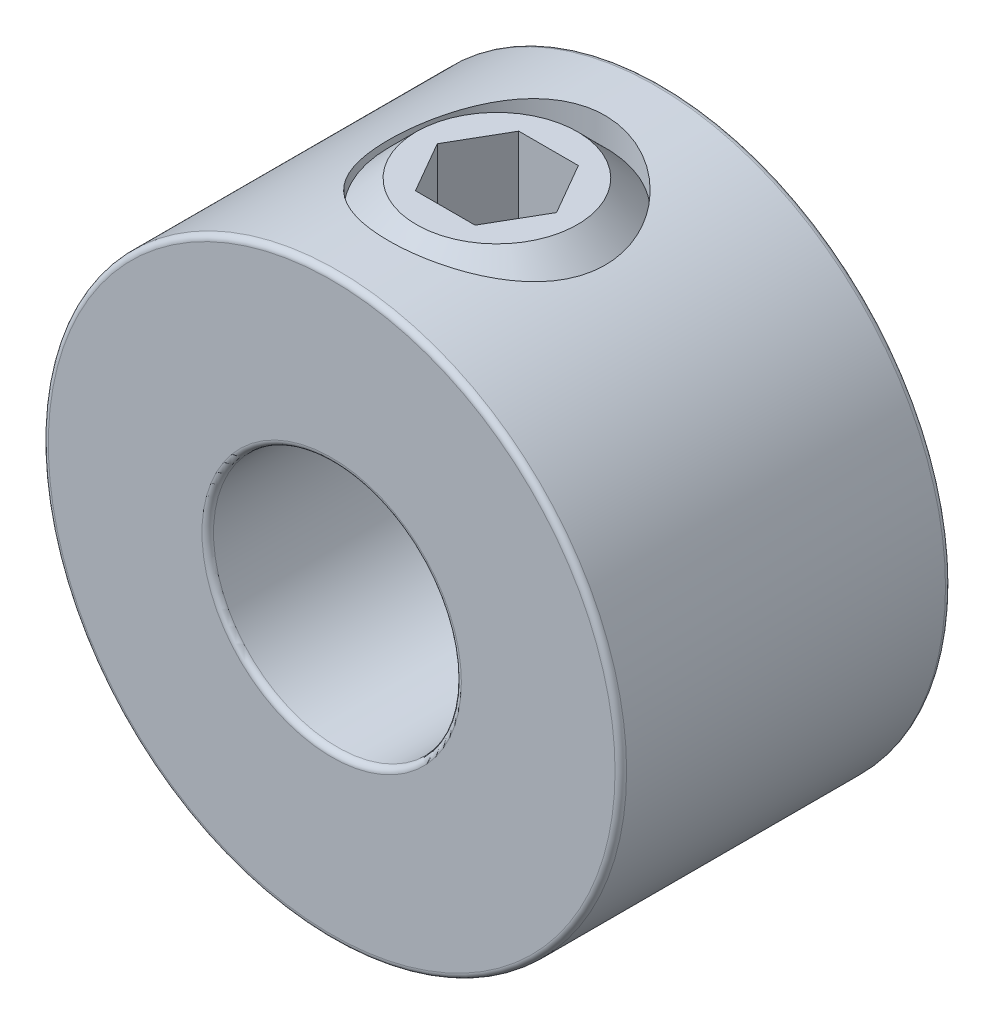
ISO-10303-21;
HEADER;
FILE_DESCRIPTION(('STEP AP214'),'2;1');
FILE_NAME('part.step','',(''),(''),'','','');
FILE_SCHEMA(('AUTOMOTIVE_DESIGN { 1 0 10303 214 1 1 1 1 }'));
ENDSEC;
DATA;
#1=APPLICATION_CONTEXT('core data for automotive mechanical design processes');
#2=APPLICATION_PROTOCOL_DEFINITION('international standard','automotive_design',2000,#1);
#3=PRODUCT_CONTEXT('',#1,'mechanical');
#4=PRODUCT('Part','Part','',(#3));
#5=PRODUCT_RELATED_PRODUCT_CATEGORY('part','',(#4));
#6=PRODUCT_DEFINITION_FORMATION('','',#4);
#7=PRODUCT_DEFINITION_CONTEXT('part definition',#1,'design');
#8=PRODUCT_DEFINITION('design','',#6,#7);
#9=PRODUCT_DEFINITION_SHAPE('','',#8);
#10=(LENGTH_UNIT() NAMED_UNIT(*) SI_UNIT(.MILLI.,.METRE.));
#11=(NAMED_UNIT(*) PLANE_ANGLE_UNIT() SI_UNIT($,.RADIAN.));
#12=(NAMED_UNIT(*) SI_UNIT($,.STERADIAN.) SOLID_ANGLE_UNIT());
#13=UNCERTAINTY_MEASURE_WITH_UNIT(LENGTH_MEASURE(1.E-05),#10,'distance_accuracy_value','');
#14=(GEOMETRIC_REPRESENTATION_CONTEXT(3) GLOBAL_UNCERTAINTY_ASSIGNED_CONTEXT((#13)) GLOBAL_UNIT_ASSIGNED_CONTEXT((#10,
#11,#12)) REPRESENTATION_CONTEXT('',''));
#15=CARTESIAN_POINT('',(0.,0.,0.));
#16=DIRECTION('',(0.,0.,1.));
#17=DIRECTION('',(1.,0.,0.));
#18=AXIS2_PLACEMENT_3D('',#15,#16,#17);
#19=CARTESIAN_POINT('',(0.,5.55625,0.));
#20=DIRECTION('',(0.,1.,0.));
#21=DIRECTION('',(-1.,0.,0.));
#22=AXIS2_PLACEMENT_3D('',#19,#20,#21);
#23=PLANE('',#22);
#24=CARTESIAN_POINT('',(0.,5.55625,0.));
#25=DIRECTION('',(0.,1.,0.));
#26=DIRECTION('',(-1.,0.,0.));
#27=AXIS2_PLACEMENT_3D('',#24,#25,#26);
#28=CIRCLE('',#27,1.54730253738467);
#29=CARTESIAN_POINT('',(-1.54730253738467,5.55625,0.));
#30=VERTEX_POINT('',#29);
#31=EDGE_CURVE('E12',#30,#30,#28,.T.);
#32=ORIENTED_EDGE('',*,*,#31,.T.);
#33=EDGE_LOOP('',(#32));
#34=FACE_BOUND('',#33,.T.);
#35=DIRECTION('',(1.,0.,0.));
#36=VECTOR('',#35,1.);
#37=CARTESIAN_POINT('',(-0.572839720211582,5.55624999999999,-0.992187499999998));
#38=LINE('',#37,#36);
#39=CARTESIAN_POINT('',(-0.572839720211582,5.55624999999999,-0.992187499999998));
#40=VERTEX_POINT('',#39);
#41=CARTESIAN_POINT('',(0.572839720211582,5.55625,-0.992187499999998));
#42=VERTEX_POINT('',#41);
#43=EDGE_CURVE('E115',#40,#42,#38,.T.);
#44=ORIENTED_EDGE('',*,*,#43,.T.);
#45=DIRECTION('',(0.5,0.,0.866025403784438));
#46=VECTOR('',#45,1.);
#47=CARTESIAN_POINT('',(0.572839720211582,5.55624999999999,-0.992187499999998));
#48=LINE('',#47,#46);
#49=CARTESIAN_POINT('',(1.14567944042316,5.55624999999999,0.));
#50=VERTEX_POINT('',#49);
#51=EDGE_CURVE('E61',#42,#50,#48,.T.);
#52=ORIENTED_EDGE('',*,*,#51,.T.);
#53=DIRECTION('',(-0.5,0.,0.866025403784439));
#54=VECTOR('',#53,1.);
#55=CARTESIAN_POINT('',(1.14567944042316,5.55624999999999,0.));
#56=LINE('',#55,#54);
#57=CARTESIAN_POINT('',(0.572839720211582,5.55624999999999,0.992187500000003));
#58=VERTEX_POINT('',#57);
#59=EDGE_CURVE('E119',#50,#58,#56,.T.);
#60=ORIENTED_EDGE('',*,*,#59,.T.);
#61=DIRECTION('',(-1.,0.,0.));
#62=VECTOR('',#61,1.);
#63=CARTESIAN_POINT('',(0.572839720211582,5.55624999999999,0.992187500000003));
#64=LINE('',#63,#62);
#65=CARTESIAN_POINT('',(-0.572839720211583,5.55624999999999,0.992187500000003));
#66=VERTEX_POINT('',#65);
#67=EDGE_CURVE('E182',#58,#66,#64,.T.);
#68=ORIENTED_EDGE('',*,*,#67,.T.);
#69=DIRECTION('',(-0.5,0.,-0.866025403784438));
#70=VECTOR('',#69,1.);
#71=CARTESIAN_POINT('',(-0.572839720211583,5.55624999999999,0.992187500000003));
#72=LINE('',#71,#70);
#73=CARTESIAN_POINT('',(-1.14567944042316,5.55624999999999,0.));
#74=VERTEX_POINT('',#73);
#75=EDGE_CURVE('E167',#66,#74,#72,.T.);
#76=ORIENTED_EDGE('',*,*,#75,.T.);
#77=DIRECTION('',(0.5,0.,-0.866025403784439));
#78=VECTOR('',#77,1.);
#79=CARTESIAN_POINT('',(-1.14567944042316,5.55624999999999,0.));
#80=LINE('',#79,#78);
#81=EDGE_CURVE('E163',#74,#40,#80,.T.);
#82=ORIENTED_EDGE('',*,*,#81,.T.);
#83=EDGE_LOOP('',(#44,#52,#60,#68,#76,#82));
#84=FACE_BOUND('',#83,.T.);
#85=ADVANCED_FACE('F47',(#34,#84),#23,.T.);
#86=CARTESIAN_POINT('',(0.,5.55625,0.));
#87=DIRECTION('',(0.,-1.,0.));
#88=DIRECTION('',(1.,0.,0.));
#89=AXIS2_PLACEMENT_3D('',#86,#87,#88);
#90=CONICAL_SURFACE('',#89,1.54730253738467,0.785398163397448);
#91=CARTESIAN_POINT('',(0.,5.02075253738467,0.));
#92=DIRECTION('',(0.,1.,0.));
#93=DIRECTION('',(-1.,0.,0.));
#94=AXIS2_PLACEMENT_3D('',#91,#92,#93);
#95=CIRCLE('',#94,2.0828);
#96=CARTESIAN_POINT('',(-2.0828,5.02075253738467,0.));
#97=VERTEX_POINT('',#96);
#98=EDGE_CURVE('E54',#97,#97,#95,.T.);
#99=ORIENTED_EDGE('',*,*,#98,.T.);
#100=EDGE_LOOP('',(#99));
#101=FACE_BOUND('',#100,.T.);
#102=ORIENTED_EDGE('',*,*,#31,.F.);
#103=EDGE_LOOP('',(#102));
#104=FACE_BOUND('',#103,.T.);
#105=ADVANCED_FACE('F137',(#101,#104),#90,.T.);
#106=CARTESIAN_POINT('',(0.,2.38125,0.));
#107=DIRECTION('',(0.,1.,0.));
#108=DIRECTION('',(-1.,0.,0.));
#109=AXIS2_PLACEMENT_3D('',#106,#107,#108);
#110=CYLINDRICAL_SURFACE('',#109,2.0828);
#111=CARTESIAN_POINT('',(0.,2.91674746261534,0.));
#112=DIRECTION('',(0.,1.,0.));
#113=DIRECTION('',(-1.,0.,0.));
#114=AXIS2_PLACEMENT_3D('',#111,#112,#113);
#115=CIRCLE('',#114,2.0828);
#116=CARTESIAN_POINT('',(-2.0828,2.91674746261534,0.));
#117=VERTEX_POINT('',#116);
#118=EDGE_CURVE('E132',#117,#117,#115,.T.);
#119=ORIENTED_EDGE('',*,*,#118,.T.);
#120=EDGE_LOOP('',(#119));
#121=FACE_BOUND('',#120,.T.);
#122=ORIENTED_EDGE('',*,*,#98,.F.);
#123=EDGE_LOOP('',(#122));
#124=FACE_BOUND('',#123,.T.);
#125=ADVANCED_FACE('F140',(#121,#124),#110,.T.);
#126=CARTESIAN_POINT('',(0.,2.91674746261534,0.));
#127=DIRECTION('',(0.,1.,0.));
#128=DIRECTION('',(-1.,0.,0.));
#129=AXIS2_PLACEMENT_3D('',#126,#127,#128);
#130=CONICAL_SURFACE('',#129,2.0828,0.785398163397448);
#131=CARTESIAN_POINT('',(0.,2.38125,0.));
#132=DIRECTION('',(0.,1.,0.));
#133=DIRECTION('',(-1.,0.,0.));
#134=AXIS2_PLACEMENT_3D('',#131,#132,#133);
#135=CIRCLE('',#134,1.54730253738467);
#136=CARTESIAN_POINT('',(-1.54730253738467,2.38125,0.));
#137=VERTEX_POINT('',#136);
#138=EDGE_CURVE('E124',#137,#137,#135,.T.);
#139=ORIENTED_EDGE('',*,*,#138,.T.);
#140=EDGE_LOOP('',(#139));
#141=FACE_BOUND('',#140,.T.);
#142=ORIENTED_EDGE('',*,*,#118,.F.);
#143=EDGE_LOOP('',(#142));
#144=FACE_BOUND('',#143,.T.);
#145=ADVANCED_FACE('F142',(#141,#144),#130,.T.);
#146=CARTESIAN_POINT('',(-1.54730253738467,2.38125,0.));
#147=DIRECTION('',(0.,-1.,0.));
#148=DIRECTION('',(1.,0.,0.));
#149=AXIS2_PLACEMENT_3D('',#146,#147,#148);
#150=PLANE('',#149);
#151=CARTESIAN_POINT('',(0.,2.38125,0.));
#152=DIRECTION('',(0.,1.,0.));
#153=DIRECTION('',(-1.,0.,0.));
#154=AXIS2_PLACEMENT_3D('',#151,#152,#153);
#155=CIRCLE('',#154,0.642596955138402);
#156=CARTESIAN_POINT('',(-0.642596955138402,2.38125,0.));
#157=VERTEX_POINT('',#156);
#158=EDGE_CURVE('E120',#157,#157,#155,.T.);
#159=ORIENTED_EDGE('',*,*,#158,.T.);
#160=EDGE_LOOP('',(#159));
#161=FACE_BOUND('',#160,.T.);
#162=ORIENTED_EDGE('',*,*,#138,.F.);
#163=EDGE_LOOP('',(#162));
#164=FACE_BOUND('',#163,.T.);
#165=ADVANCED_FACE('F149',(#161,#164),#150,.T.);
#166=CARTESIAN_POINT('',(0.,2.38125,0.));
#167=DIRECTION('',(0.,-1.,0.));
#168=DIRECTION('',(1.,0.,0.));
#169=AXIS2_PLACEMENT_3D('',#166,#167,#168);
#170=CONICAL_SURFACE('',#169,0.642596955138402,0.785398163397448);
#171=CARTESIAN_POINT('',(0.,3.0238469551384,0.));
#172=VERTEX_POINT('',#171);
#173=VERTEX_LOOP('',#172);
#174=FACE_BOUND('',#173,.T.);
#175=ORIENTED_EDGE('',*,*,#158,.F.);
#176=EDGE_LOOP('',(#175));
#177=FACE_BOUND('',#176,.T.);
#178=ADVANCED_FACE('F216',(#174,#177),#170,.F.);
#179=CARTESIAN_POINT('',(0.572839720211582,3.57187499999999,-0.992187499999998));
#180=DIRECTION('',(-0.866025403784438,0.,0.5));
#181=DIRECTION('',(0.5,0.,0.866025403784439));
#182=AXIS2_PLACEMENT_3D('',#179,#180,#181);
#183=PLANE('',#182);
#184=ORIENTED_EDGE('',*,*,#51,.F.);
#185=DIRECTION('',(0.,1.,0.));
#186=VECTOR('',#185,1.);
#187=CARTESIAN_POINT('',(0.572839720211582,3.57187499999999,-0.992187499999998));
#188=LINE('',#187,#186);
#189=CARTESIAN_POINT('',(0.572839720211582,3.57187499999999,-0.992187499999998));
#190=VERTEX_POINT('',#189);
#191=EDGE_CURVE('E114',#190,#42,#188,.T.);
#192=ORIENTED_EDGE('',*,*,#191,.F.);
#193=DIRECTION('',(0.5,0.,0.866025403784438));
#194=VECTOR('',#193,1.);
#195=CARTESIAN_POINT('',(0.572839720211582,3.57187499999999,-0.992187499999998));
#196=LINE('',#195,#194);
#197=CARTESIAN_POINT('',(1.14567944042316,3.57187499999999,0.));
#198=VERTEX_POINT('',#197);
#199=EDGE_CURVE('E105',#190,#198,#196,.T.);
#200=ORIENTED_EDGE('',*,*,#199,.T.);
#201=DIRECTION('',(0.,1.,0.));
#202=VECTOR('',#201,1.);
#203=CARTESIAN_POINT('',(1.14567944042316,3.57187499999999,0.));
#204=LINE('',#203,#202);
#205=EDGE_CURVE('E113',#198,#50,#204,.T.);
#206=ORIENTED_EDGE('',*,*,#205,.T.);
#207=EDGE_LOOP('',(#184,#192,#200,#206));
#208=FACE_BOUND('',#207,.T.);
#209=ADVANCED_FACE('F112',(#208),#183,.T.);
#210=CARTESIAN_POINT('',(1.14567944042316,3.57187499999999,0.));
#211=DIRECTION('',(-0.866025403784439,0.,-0.499999999999999));
#212=DIRECTION('',(-0.5,0.,0.866025403784439));
#213=AXIS2_PLACEMENT_3D('',#210,#211,#212);
#214=PLANE('',#213);
#215=ORIENTED_EDGE('',*,*,#59,.F.);
#216=ORIENTED_EDGE('',*,*,#205,.F.);
#217=DIRECTION('',(-0.5,0.,0.866025403784439));
#218=VECTOR('',#217,1.);
#219=CARTESIAN_POINT('',(1.14567944042316,3.57187499999999,0.));
#220=LINE('',#219,#218);
#221=CARTESIAN_POINT('',(0.572839720211582,3.57187499999999,0.992187500000003));
#222=VERTEX_POINT('',#221);
#223=EDGE_CURVE('E101',#198,#222,#220,.T.);
#224=ORIENTED_EDGE('',*,*,#223,.T.);
#225=DIRECTION('',(0.,1.,0.));
#226=VECTOR('',#225,1.);
#227=CARTESIAN_POINT('',(0.572839720211582,3.57187499999999,0.992187500000003));
#228=LINE('',#227,#226);
#229=EDGE_CURVE('E121',#222,#58,#228,.T.);
#230=ORIENTED_EDGE('',*,*,#229,.T.);
#231=EDGE_LOOP('',(#215,#216,#224,#230));
#232=FACE_BOUND('',#231,.T.);
#233=ADVANCED_FACE('F117',(#232),#214,.T.);
#234=CARTESIAN_POINT('',(0.572839720211582,3.57187499999999,0.992187500000003));
#235=DIRECTION('',(0.,0.,-1.));
#236=DIRECTION('',(-1.,0.,0.));
#237=AXIS2_PLACEMENT_3D('',#234,#235,#236);
#238=PLANE('',#237);
#239=ORIENTED_EDGE('',*,*,#67,.F.);
#240=ORIENTED_EDGE('',*,*,#229,.F.);
#241=DIRECTION('',(-1.,0.,0.));
#242=VECTOR('',#241,1.);
#243=CARTESIAN_POINT('',(0.572839720211582,3.57187499999999,0.992187500000003));
#244=LINE('',#243,#242);
#245=CARTESIAN_POINT('',(-0.572839720211583,3.57187499999999,0.992187500000003));
#246=VERTEX_POINT('',#245);
#247=EDGE_CURVE('E107',#222,#246,#244,.T.);
#248=ORIENTED_EDGE('',*,*,#247,.T.);
#249=DIRECTION('',(0.,1.,0.));
#250=VECTOR('',#249,1.);
#251=CARTESIAN_POINT('',(-0.572839720211583,3.57187499999999,0.992187500000003));
#252=LINE('',#251,#250);
#253=EDGE_CURVE('E126',#246,#66,#252,.T.);
#254=ORIENTED_EDGE('',*,*,#253,.T.);
#255=EDGE_LOOP('',(#239,#240,#248,#254));
#256=FACE_BOUND('',#255,.T.);
#257=ADVANCED_FACE('F180',(#256),#238,.T.);
#258=CARTESIAN_POINT('',(-0.572839720211583,3.57187499999999,0.992187500000003));
#259=DIRECTION('',(0.866025403784438,0.,-0.5));
#260=DIRECTION('',(-0.5,0.,-0.866025403784439));
#261=AXIS2_PLACEMENT_3D('',#258,#259,#260);
#262=PLANE('',#261);
#263=ORIENTED_EDGE('',*,*,#75,.F.);
#264=ORIENTED_EDGE('',*,*,#253,.F.);
#265=DIRECTION('',(-0.5,0.,-0.866025403784438));
#266=VECTOR('',#265,1.);
#267=CARTESIAN_POINT('',(-0.572839720211583,3.57187499999999,0.992187500000003));
#268=LINE('',#267,#266);
#269=CARTESIAN_POINT('',(-1.14567944042316,3.57187499999999,0.));
#270=VERTEX_POINT('',#269);
#271=EDGE_CURVE('E193',#246,#270,#268,.T.);
#272=ORIENTED_EDGE('',*,*,#271,.T.);
#273=DIRECTION('',(0.,1.,0.));
#274=VECTOR('',#273,1.);
#275=CARTESIAN_POINT('',(-1.14567944042316,3.57187499999999,0.));
#276=LINE('',#275,#274);
#277=EDGE_CURVE('E175',#270,#74,#276,.T.);
#278=ORIENTED_EDGE('',*,*,#277,.T.);
#279=EDGE_LOOP('',(#263,#264,#272,#278));
#280=FACE_BOUND('',#279,.T.);
#281=ADVANCED_FACE('F184',(#280),#262,.T.);
#282=CARTESIAN_POINT('',(-1.14567944042316,3.57187499999999,0.));
#283=DIRECTION('',(0.866025403784439,0.,0.5));
#284=DIRECTION('',(0.5,0.,-0.866025403784439));
#285=AXIS2_PLACEMENT_3D('',#282,#283,#284);
#286=PLANE('',#285);
#287=ORIENTED_EDGE('',*,*,#81,.F.);
#288=ORIENTED_EDGE('',*,*,#277,.F.);
#289=DIRECTION('',(0.5,0.,-0.866025403784439));
#290=VECTOR('',#289,1.);
#291=CARTESIAN_POINT('',(-1.14567944042316,3.57187499999999,0.));
#292=LINE('',#291,#290);
#293=CARTESIAN_POINT('',(-0.572839720211582,3.57187499999999,-0.992187499999998));
#294=VERTEX_POINT('',#293);
#295=EDGE_CURVE('E191',#270,#294,#292,.T.);
#296=ORIENTED_EDGE('',*,*,#295,.T.);
#297=DIRECTION('',(0.,1.,0.));
#298=VECTOR('',#297,1.);
#299=CARTESIAN_POINT('',(-0.572839720211582,3.57187499999999,-0.992187499999998));
#300=LINE('',#299,#298);
#301=EDGE_CURVE('E172',#294,#40,#300,.T.);
#302=ORIENTED_EDGE('',*,*,#301,.T.);
#303=EDGE_LOOP('',(#287,#288,#296,#302));
#304=FACE_BOUND('',#303,.T.);
#305=ADVANCED_FACE('F197',(#304),#286,.T.);
#306=CARTESIAN_POINT('',(-0.572839720211582,3.57187499999999,-0.992187499999998));
#307=DIRECTION('',(0.,0.,1.));
#308=DIRECTION('',(1.,0.,0.));
#309=AXIS2_PLACEMENT_3D('',#306,#307,#308);
#310=PLANE('',#309);
#311=ORIENTED_EDGE('',*,*,#43,.F.);
#312=ORIENTED_EDGE('',*,*,#301,.F.);
#313=DIRECTION('',(1.,0.,0.));
#314=VECTOR('',#313,1.);
#315=CARTESIAN_POINT('',(-0.572839720211582,3.57187499999999,-0.992187499999998));
#316=LINE('',#315,#314);
#317=EDGE_CURVE('E173',#294,#190,#316,.T.);
#318=ORIENTED_EDGE('',*,*,#317,.T.);
#319=ORIENTED_EDGE('',*,*,#191,.T.);
#320=EDGE_LOOP('',(#311,#312,#318,#319));
#321=FACE_BOUND('',#320,.T.);
#322=ADVANCED_FACE('F198',(#321),#310,.T.);
#323=CARTESIAN_POINT('',(0.,3.57187499999999,-1.984375));
#324=DIRECTION('',(0.,1.,0.));
#325=DIRECTION('',(0.,0.,1.));
#326=AXIS2_PLACEMENT_3D('',#323,#324,#325);
#327=PLANE('',#326);
#328=ORIENTED_EDGE('',*,*,#199,.F.);
#329=ORIENTED_EDGE('',*,*,#317,.F.);
#330=ORIENTED_EDGE('',*,*,#295,.F.);
#331=ORIENTED_EDGE('',*,*,#271,.F.);
#332=ORIENTED_EDGE('',*,*,#247,.F.);
#333=ORIENTED_EDGE('',*,*,#223,.F.);
#334=EDGE_LOOP('',(#328,#329,#330,#331,#332,#333));
#335=FACE_BOUND('',#334,.T.);
#336=ADVANCED_FACE('F103',(#335),#327,.T.);
#337=CLOSED_SHELL('',(#85,#105,#125,#145,#165,#178,#209,#233,#257,#281,#305,#322,#336));
#338=MANIFOLD_SOLID_BREP('B2',#337);
#339=CARTESIAN_POINT('',(0.,0.,3.175));
#340=DIRECTION('',(0.,0.,1.));
#341=DIRECTION('',(1.,0.,0.));
#342=AXIS2_PLACEMENT_3D('',#339,#340,#341);
#343=PLANE('',#342);
#344=CARTESIAN_POINT('',(0.,0.,3.175));
#345=DIRECTION('',(0.,0.,1.));
#346=DIRECTION('',(1.,0.,0.));
#347=AXIS2_PLACEMENT_3D('',#344,#345,#346);
#348=CIRCLE('',#347,2.492375);
#349=CARTESIAN_POINT('',(2.492375,0.,3.175));
#350=VERTEX_POINT('',#349);
#351=EDGE_CURVE('E315',#350,#350,#348,.F.);
#352=ORIENTED_EDGE('',*,*,#351,.T.);
#353=EDGE_LOOP('',(#352));
#354=FACE_BOUND('',#353,.T.);
#355=CARTESIAN_POINT('',(0.,0.,3.175));
#356=DIRECTION('',(0.,0.,1.));
#357=DIRECTION('',(1.,0.,0.));
#358=AXIS2_PLACEMENT_3D('',#355,#356,#357);
#359=CIRCLE('',#358,5.445125);
#360=CARTESIAN_POINT('',(5.445125,0.,3.175));
#361=VERTEX_POINT('',#360);
#362=EDGE_CURVE('E319',#361,#361,#359,.T.);
#363=ORIENTED_EDGE('',*,*,#362,.T.);
#364=EDGE_LOOP('',(#363));
#365=FACE_BOUND('',#364,.T.);
#366=ADVANCED_FACE('F304',(#354,#365),#343,.T.);
#367=CARTESIAN_POINT('',(0.,0.,-3.175));
#368=DIRECTION('',(0.,0.,1.));
#369=DIRECTION('',(1.,0.,0.));
#370=AXIS2_PLACEMENT_3D('',#367,#368,#369);
#371=PLANE('',#370);
#372=CARTESIAN_POINT('',(0.,0.,-3.175));
#373=DIRECTION('',(0.,0.,1.));
#374=DIRECTION('',(1.,0.,0.));
#375=AXIS2_PLACEMENT_3D('',#372,#373,#374);
#376=CIRCLE('',#375,2.492375);
#377=CARTESIAN_POINT('',(2.492375,0.,-3.175));
#378=VERTEX_POINT('',#377);
#379=EDGE_CURVE('E330',#378,#378,#376,.T.);
#380=ORIENTED_EDGE('',*,*,#379,.T.);
#381=EDGE_LOOP('',(#380));
#382=FACE_BOUND('',#381,.T.);
#383=CARTESIAN_POINT('',(0.,0.,-3.175));
#384=DIRECTION('',(0.,0.,1.));
#385=DIRECTION('',(1.,0.,0.));
#386=AXIS2_PLACEMENT_3D('',#383,#384,#385);
#387=CIRCLE('',#386,5.445125);
#388=CARTESIAN_POINT('',(5.445125,0.,-3.175));
#389=VERTEX_POINT('',#388);
#390=EDGE_CURVE('E333',#389,#389,#387,.F.);
#391=ORIENTED_EDGE('',*,*,#390,.T.);
#392=EDGE_LOOP('',(#391));
#393=FACE_BOUND('',#392,.T.);
#394=ADVANCED_FACE('F367',(#382,#393),#371,.F.);
#395=CARTESIAN_POINT('',(0.,0.,3.175));
#396=DIRECTION('',(0.,0.,-1.));
#397=DIRECTION('',(-1.,0.,0.));
#398=AXIS2_PLACEMENT_3D('',#395,#396,#397);
#399=CYLINDRICAL_SURFACE('',#398,5.55625);
#400=CARTESIAN_POINT('',(0.,0.,-3.063875));
#401=DIRECTION('',(0.,0.,1.));
#402=DIRECTION('',(1.,0.,0.));
#403=AXIS2_PLACEMENT_3D('',#400,#401,#402);
#404=CIRCLE('',#403,5.55625);
#405=CARTESIAN_POINT('',(5.55625,0.,-3.063875));
#406=VERTEX_POINT('',#405);
#407=EDGE_CURVE('E46',#406,#406,#404,.T.);
#408=ORIENTED_EDGE('',*,*,#407,.T.);
#409=EDGE_LOOP('',(#408));
#410=FACE_BOUND('',#409,.T.);
#411=CARTESIAN_POINT('',(0.,0.,3.063875));
#412=DIRECTION('',(0.,0.,1.));
#413=DIRECTION('',(1.,0.,0.));
#414=AXIS2_PLACEMENT_3D('',#411,#412,#413);
#415=CIRCLE('',#414,5.55625);
#416=CARTESIAN_POINT('',(5.55625,0.,3.063875));
#417=VERTEX_POINT('',#416);
#418=EDGE_CURVE('E311',#417,#417,#415,.F.);
#419=ORIENTED_EDGE('',*,*,#418,.T.);
#420=EDGE_LOOP('',(#419));
#421=FACE_BOUND('',#420,.T.);
#422=CARTESIAN_POINT('',(0.,5.55625,-2.0828));
#423=CARTESIAN_POINT('',(0.112800632930004,5.55625300768121,-2.08280401535049));
#424=CARTESIAN_POINT('',(0.22557375650504,5.55278505962081,-2.07360774080138));
#425=CARTESIAN_POINT('',(0.447749891057454,5.5392973200522,-2.03721439435715));
#426=CARTESIAN_POINT('',(0.55715338230433,5.5292784668036,-2.0100199002673));
#427=CARTESIAN_POINT('',(0.7693540019046,5.50376437690656,-1.93872693071781));
#428=CARTESIAN_POINT('',(0.872163424064122,5.48827970334317,-1.89466104660532));
#429=CARTESIAN_POINT('',(1.06892323856479,5.4533764248173,-1.79104186225435));
#430=CARTESIAN_POINT('',(1.16287124747356,5.43395676586827,-1.73148441138188));
#431=CARTESIAN_POINT('',(1.34322911463978,5.39226740506348,-1.59593235187956));
#432=CARTESIAN_POINT('',(1.42921302733438,5.36991708646606,-1.51939602956842));
#433=CARTESIAN_POINT('',(1.58746804313499,5.3252823776817,-1.35320883055734));
#434=CARTESIAN_POINT('',(1.65973495359077,5.30299800969504,-1.26355395890717));
#435=CARTESIAN_POINT('',(1.79121226481723,5.26008047465291,-1.06951383102155));
#436=CARTESIAN_POINT('',(1.84982111942716,5.23954242039672,-0.964697836024094));
#437=CARTESIAN_POINT('',(1.94838923392661,5.20369722833776,-0.745805447537557));
#438=CARTESIAN_POINT('',(1.98835593632194,5.18838800368424,-0.631732770982777));
#439=CARTESIAN_POINT('',(2.04682402169344,5.16559576084147,-0.402467790242334));
#440=CARTESIAN_POINT('',(2.06613822134155,5.15781763095547,-0.287513102391948));
#441=CARTESIAN_POINT('',(2.08529440426013,5.15010472983807,-0.0557514095444379));
#442=CARTESIAN_POINT('',(2.08514442146683,5.15016672255756,0.0610548113178707));
#443=CARTESIAN_POINT('',(2.06599808773832,5.15787259600182,0.285767992124775));
#444=CARTESIAN_POINT('',(2.04812917392808,5.16506290320801,0.393789454265148));
#445=CARTESIAN_POINT('',(1.99591596349076,5.18546148958707,0.605171149502855));
#446=CARTESIAN_POINT('',(1.96156918768862,5.19867067431454,0.708530678628621));
#447=CARTESIAN_POINT('',(1.87675563584502,5.2298919804838,0.909953267713995));
#448=CARTESIAN_POINT('',(1.82599630573539,5.24799020400401,1.00787920704196));
#449=CARTESIAN_POINT('',(1.71000247451572,5.28692170218376,1.19415076370434));
#450=CARTESIAN_POINT('',(1.64476297834093,5.3077559196341,1.28249305937992));
#451=CARTESIAN_POINT('',(1.4965021407131,5.35151860221495,1.45333045485081));
#452=CARTESIAN_POINT('',(1.41258090144428,5.37449375049466,1.53503453035891));
#453=CARTESIAN_POINT('',(1.23196365426747,5.41874674251992,1.68344452863914));
#454=CARTESIAN_POINT('',(1.1352656895903,5.44002432547937,1.75014814983905));
#455=CARTESIAN_POINT('',(0.929823331313823,5.47890719997606,1.86753532666365));
#456=CARTESIAN_POINT('',(0.820915981682845,5.49645071347302,1.91795560812022));
#457=CARTESIAN_POINT('',(0.595343579335006,5.52543048412729,1.99949665444985));
#458=CARTESIAN_POINT('',(0.478681994972036,5.53686945135909,2.03062598440935));
#459=CARTESIAN_POINT('',(0.247570187168623,5.5518749936626,2.07118115087403));
#460=CARTESIAN_POINT('',(0.133331773827584,5.55582753103965,2.08167220007853));
#461=CARTESIAN_POINT('',(-0.0953283436577317,5.55660748535906,2.083754441011));
#462=CARTESIAN_POINT('',(-0.209750001589684,5.55343648058412,2.07534981923885));
#463=CARTESIAN_POINT('',(-0.430926540416132,5.54058024960133,2.04068898213469));
#464=CARTESIAN_POINT('',(-0.537807116159227,5.53114977163135,2.01513045938022));
#465=CARTESIAN_POINT('',(-0.745687864829837,5.50697945787875,1.94780582513564));
#466=CARTESIAN_POINT('',(-0.846687270958335,5.49223893155362,1.90603760560919));
#467=CARTESIAN_POINT('',(-1.04326337793135,5.45836614698944,1.80614776949349));
#468=CARTESIAN_POINT('',(-1.13859364241543,5.43911760327552,1.74758182189689));
#469=CARTESIAN_POINT('',(-1.31839271067494,5.39835785558102,1.61626143061731));
#470=CARTESIAN_POINT('',(-1.40285748760972,5.37684581806946,1.54350175161408));
#471=CARTESIAN_POINT('',(-1.5636497571678,5.33237981787699,1.3808954905382));
#472=CARTESIAN_POINT('',(-1.63922162799222,5.30941456183645,1.2903028632398));
#473=CARTESIAN_POINT('',(-1.77423955261877,5.26583668916757,1.09727040858404));
#474=CARTESIAN_POINT('',(-1.83368416430154,5.24522428302937,0.994829522908312));
#475=CARTESIAN_POINT('',(-1.93481923474378,5.2087720132518,0.780165029958659));
#476=CARTESIAN_POINT('',(-1.97643552425905,5.19295216591895,0.667902850327276));
#477=CARTESIAN_POINT('',(-2.03990093033916,5.16835555583759,0.437205681476789));
#478=CARTESIAN_POINT('',(-2.06176226343082,5.15957444069517,0.318774555150432));
#479=CARTESIAN_POINT('',(-2.08400604935767,5.15062742767764,0.0872883285335795));
#480=CARTESIAN_POINT('',(-2.08567688417979,5.14994480894648,-0.0256240229937523));
#481=CARTESIAN_POINT('',(-2.07079252565419,5.15594759760087,-0.250030481291804));
#482=CARTESIAN_POINT('',(-2.05423905778867,5.16263230744571,-0.361524721318785));
#483=CARTESIAN_POINT('',(-2.0043787434665,5.1821866620233,-0.576481637548906));
#484=CARTESIAN_POINT('',(-1.97159779594338,5.19486162518906,-0.68008552574187));
#485=CARTESIAN_POINT('',(-1.89067616429862,5.22485507472632,-0.880383384458793));
#486=CARTESIAN_POINT('',(-1.84253159866192,5.24217473437253,-0.97707560123107));
#487=CARTESIAN_POINT('',(-1.72932228141872,5.28063498027688,-1.16631306072801));
#488=CARTESIAN_POINT('',(-1.6635032144585,5.30192820905341,-1.25837563942295));
#489=CARTESIAN_POINT('',(-1.51798138023012,5.34541005082352,-1.43056079319698));
#490=CARTESIAN_POINT('',(-1.43827420211132,5.36759894655465,-1.51067955988693));
#491=CARTESIAN_POINT('',(-1.26208849099773,5.41181284852435,-1.66111819025951));
#492=CARTESIAN_POINT('',(-1.16493627252017,5.43376415796984,-1.73067424974454));
#493=CARTESIAN_POINT('',(-0.959551270436361,5.47376576077515,-1.85244953260773));
#494=CARTESIAN_POINT('',(-0.851317639554694,5.491815755515,-1.90466742902754));
#495=CARTESIAN_POINT('',(-0.62186338385069,5.5226027657999,-1.99173944958096));
#496=CARTESIAN_POINT('',(-0.500284487091534,5.53507803240463,-2.02575064676068));
#497=CARTESIAN_POINT('',(-0.252457334192373,5.55189793213197,-2.07127304477625));
#498=CARTESIAN_POINT('',(-0.126211447425829,5.55624663473698,-2.08279550726637));
#499=CARTESIAN_POINT('',(0.,5.55625,-2.0828));
#500=B_SPLINE_CURVE_WITH_KNOTS('',3,(#422,#423,#424,#425,#426,#427,#428,#429,#430,#431,#432,
#433,#434,#435,#436,#437,#438,#439,#440,#441,#442,#443,#444,#445,#446,#447,#448,#449,#450,#451,
#452,#453,#454,#455,#456,#457,#458,#459,#460,#461,#462,#463,#464,#465,#466,#467,#468,#469,#470,
#471,#472,#473,#474,#475,#476,#477,#478,#479,#480,#481,#482,#483,#484,#485,#486,#487,#488,#489,
#490,#491,#492,#493,#494,#495,#496,#497,#498,#499),.UNSPECIFIED.,.T.,.F.,(4,2,2,2,2,2,2,2,2,2,2,
2,2,2,2,2,2,2,2,2,2,2,2,2,2,2,2,2,2,2,2,2,2,2,2,2,2,2,4),(0.,0.337936375735737,
0.675824360812358,1.01306289665027,1.35039188157959,1.70062735361547,2.05096970458192,
2.41464480516559,2.77817459121935,3.12680120299707,3.47528391789854,3.80292943607457,
4.13062426559094,4.46451595605232,4.7985230049902,5.15495935990809,5.51145036684649,
5.87344604132048,6.23528087614685,6.57789186152055,6.92042694593843,7.24981241891747,
7.57924074213389,7.91834581789554,8.25757620897215,8.6164728789594,8.97540163135854,
9.33580942789548,9.6959941942964,10.0330639252718,10.3701017451327,10.6968689808505,
11.023718837565,11.3676926275184,11.7117758630099,12.0744589282967,12.4371697447618,
12.8154727091034,13.1935861825084),.UNSPECIFIED.);
#501=CARTESIAN_POINT('',(0.,5.55625,-2.0828));
#502=VERTEX_POINT('',#501);
#503=EDGE_CURVE('E336',#502,#502,#500,.T.);
#504=ORIENTED_EDGE('',*,*,#503,.T.);
#505=EDGE_LOOP('',(#504));
#506=FACE_BOUND('',#505,.T.);
#507=ADVANCED_FACE('F363',(#410,#421,#506),#399,.T.);
#508=CARTESIAN_POINT('',(0.,0.,3.175));
#509=DIRECTION('',(0.,0.,-1.));
#510=DIRECTION('',(-1.,0.,0.));
#511=AXIS2_PLACEMENT_3D('',#508,#509,#510);
#512=CYLINDRICAL_SURFACE('',#511,2.38125);
#513=CARTESIAN_POINT('',(0.,0.,-3.063875));
#514=DIRECTION('',(0.,0.,1.));
#515=DIRECTION('',(1.,0.,0.));
#516=AXIS2_PLACEMENT_3D('',#513,#514,#515);
#517=CIRCLE('',#516,2.38125);
#518=CARTESIAN_POINT('',(2.38125,0.,-3.063875));
#519=VERTEX_POINT('',#518);
#520=EDGE_CURVE('E324',#519,#519,#517,.F.);
#521=ORIENTED_EDGE('',*,*,#520,.T.);
#522=EDGE_LOOP('',(#521));
#523=FACE_BOUND('',#522,.T.);
#524=CARTESIAN_POINT('',(0.,0.,3.063875));
#525=DIRECTION('',(0.,0.,1.));
#526=DIRECTION('',(1.,0.,0.));
#527=AXIS2_PLACEMENT_3D('',#524,#525,#526);
#528=CIRCLE('',#527,2.38125);
#529=CARTESIAN_POINT('',(2.38125,0.,3.063875));
#530=VERTEX_POINT('',#529);
#531=EDGE_CURVE('E327',#530,#530,#528,.T.);
#532=ORIENTED_EDGE('',*,*,#531,.T.);
#533=EDGE_LOOP('',(#532));
#534=FACE_BOUND('',#533,.T.);
#535=CARTESIAN_POINT('',(0.,2.38125,-2.0828));
#536=CARTESIAN_POINT('',(0.0973929494177684,2.38124169738782,-2.0827915570918));
#537=CARTESIAN_POINT('',(0.194878185940059,2.37521781554013,-2.07591171882672));
#538=CARTESIAN_POINT('',(0.386611258583447,2.35164968767381,-2.04890264000986));
#539=CARTESIAN_POINT('',(0.480853978952414,2.3340880433526,-2.02875338981486));
#540=CARTESIAN_POINT('',(0.662803659347758,2.28905523455364,-1.97677664742931));
#541=CARTESIAN_POINT('',(0.75054877728157,2.2616485703984,-1.94502514538759));
#542=CARTESIAN_POINT('',(0.918571873428455,2.19878218385056,-1.87155180534715));
#543=CARTESIAN_POINT('',(0.99884811071721,2.1633205905272,-1.82982765086731));
#544=CARTESIAN_POINT('',(1.18071922841444,2.07129585780852,-1.72022822579019));
#545=CARTESIAN_POINT('',(1.27853737094912,2.0118781146196,-1.64848208475406));
#546=CARTESIAN_POINT('',(1.45806357215512,1.88586761865119,-1.49209731149189));
#547=CARTESIAN_POINT('',(1.53972806694118,1.81925619295101,-1.40742487863816));
#548=CARTESIAN_POINT('',(1.68869453885767,1.6819858226797,-1.2249729255154));
#549=CARTESIAN_POINT('',(1.75564607190694,1.61127039279956,-1.12694868304153));
#550=CARTESIAN_POINT('',(1.84345429424187,1.50800710053804,-0.97121630008627));
#551=CARTESIAN_POINT('',(1.87060881961605,1.47407256364515,-0.917888521467719));
#552=CARTESIAN_POINT('',(1.92061526818784,1.40829212459068,-0.808044061015269));
#553=CARTESIAN_POINT('',(1.94347046844694,1.37644464378392,-0.751529851023461));
#554=CARTESIAN_POINT('',(1.9852419773873,1.315511128209,-0.63318871451696));
#555=CARTESIAN_POINT('',(2.0040184380061,1.28653757816364,-0.571252869807721));
#556=CARTESIAN_POINT('',(2.03611895045125,1.23510794067766,-0.443396479408751));
#557=CARTESIAN_POINT('',(2.04945357647637,1.21263923840387,-0.377483949924727));
#558=CARTESIAN_POINT('',(2.06824894331714,1.18025423126636,-0.252487067881276));
#559=CARTESIAN_POINT('',(2.07460644232956,1.16893709122594,-0.193915875114199));
#560=CARTESIAN_POINT('',(2.08227591133755,1.1552262688524,-0.0754398336108357));
#561=CARTESIAN_POINT('',(2.08359575166085,1.15281866733807,-0.0155372123750084));
#562=CARTESIAN_POINT('',(2.08106950061304,1.15736954716532,0.10377947309331));
#563=CARTESIAN_POINT('',(2.07722335982678,1.16432811809892,0.163193532646999));
#564=CARTESIAN_POINT('',(2.06473187058198,1.18633414982618,0.280011030793917));
#565=CARTESIAN_POINT('',(2.05607696372146,1.20139771906409,0.337410222062291));
#566=CARTESIAN_POINT('',(2.02802431587873,1.24843208844284,0.483285695571535));
#567=CARTESIAN_POINT('',(2.0052950866678,1.28511818916213,0.569556080939492));
#568=CARTESIAN_POINT('',(1.95069238856916,1.36659247872681,0.735199379665903));
#569=CARTESIAN_POINT('',(1.91878058772755,1.41141433391192,0.814541523232048));
#570=CARTESIAN_POINT('',(1.85374053193307,1.4954086671148,0.951979144551208));
#571=CARTESIAN_POINT('',(1.82209669171924,1.53394908324055,1.01117643344989));
#572=CARTESIAN_POINT('',(1.7535497701739,1.61186697150651,1.12587193974643));
#573=CARTESIAN_POINT('',(1.71664375526402,1.65124490005753,1.18136806830602));
#574=CARTESIAN_POINT('',(1.59813215574374,1.76880002686161,1.34230349146105));
#575=CARTESIAN_POINT('',(1.50860748259122,1.84657107217174,1.44245348058046));
#576=CARTESIAN_POINT('',(1.33111081686616,1.97680164405594,1.60536484894449));
#577=CARTESIAN_POINT('',(1.2474304118645,2.030991477709,1.67144637043296));
#578=CARTESIAN_POINT('',(1.06747624024202,2.13105292684301,1.79170691658156));
#579=CARTESIAN_POINT('',(0.971224582250847,2.17693881588416,1.84590639972253));
#580=CARTESIAN_POINT('',(0.786487670098551,2.2493775064581,1.93074791918545));
#581=CARTESIAN_POINT('',(0.699954147004295,2.27794385536502,1.96390422775058));
#582=CARTESIAN_POINT('',(0.520793119382111,2.32544428673337,2.0188083522579));
#583=CARTESIAN_POINT('',(0.428169243423068,2.34438404693158,2.04056289316922));
#584=CARTESIAN_POINT('',(0.238703740611497,2.37119511602025,2.07131064044599));
#585=CARTESIAN_POINT('',(0.141842410931581,2.37900740222367,2.08023579908841));
#586=CARTESIAN_POINT('',(-0.0523955060058431,2.38265255041335,2.08440375485637));
#587=CARTESIAN_POINT('',(-0.149771977636558,2.37848799554894,2.07964950233922));
#588=CARTESIAN_POINT('',(-0.333417297278393,2.35944401934361,2.05783976327474));
#589=CARTESIAN_POINT('',(-0.419921362705574,2.34551655690229,2.04187697729471));
#590=CARTESIAN_POINT('',(-0.588497013987459,2.30899723417267,1.99982015891983));
#591=CARTESIAN_POINT('',(-0.670567354547542,2.28640295393225,1.97372329685926));
#592=CARTESIAN_POINT('',(-0.834142460455976,2.23214619164943,1.91061768628117));
#593=CARTESIAN_POINT('',(-0.915238018142442,2.19997605475041,1.87299313522874));
#594=CARTESIAN_POINT('',(-1.06973790107796,2.1291435848645,1.78925944566484));
#595=CARTESIAN_POINT('',(-1.14314144650041,2.09048059465548,1.74314944819089));
#596=CARTESIAN_POINT('',(-1.31770085106055,1.98718542053429,1.61816159612165));
#597=CARTESIAN_POINT('',(-1.41372053301883,1.91942197272719,1.53462557700656));
#598=CARTESIAN_POINT('',(-1.54405950381832,1.8136716925882,1.39924808150429));
#599=CARTESIAN_POINT('',(-1.58533102215397,1.77761865067373,1.35228117053609));
#600=CARTESIAN_POINT('',(-1.66329341929083,1.70488698426772,1.25514334461923));
#601=CARTESIAN_POINT('',(-1.69998620126694,1.66820862694579,1.20497377406766));
#602=CARTESIAN_POINT('',(-1.76960725317859,1.59420288842062,1.10026956556511));
#603=CARTESIAN_POINT('',(-1.80242857649599,1.55688016476042,1.04566071337523));
#604=CARTESIAN_POINT('',(-1.86328181449458,1.4835102025302,0.932922288615078));
#605=CARTESIAN_POINT('',(-1.89130956250531,1.44746409497991,0.874789711994487));
#606=CARTESIAN_POINT('',(-1.94217659913758,1.37844995486942,0.755120520620424));
#607=CARTESIAN_POINT('',(-1.96504973641606,1.3454627318646,0.693609622021643));
#608=CARTESIAN_POINT('',(-2.00538160065762,1.28457172881987,0.566508783544598));
#609=CARTESIAN_POINT('',(-2.02285220015144,1.25665685838627,0.500928173840036));
#610=CARTESIAN_POINT('',(-2.0496582830042,1.21236670583819,0.374843619911241));
#611=CARTESIAN_POINT('',(-2.05978578294623,1.19492816601372,0.314896244871539));
#612=CARTESIAN_POINT('',(-2.07478566572983,1.16869725413225,0.192590126820945));
#613=CARTESIAN_POINT('',(-2.07967446298945,1.15987788333444,0.130239553653282));
#614=CARTESIAN_POINT('',(-2.08375269156674,1.15254090780492,0.00428832248300671));
#615=CARTESIAN_POINT('',(-2.08290405944575,1.1540921030598,-0.0593178873715247));
#616=CARTESIAN_POINT('',(-2.07551385144013,1.16732270014716,-0.185189614836443));
#617=CARTESIAN_POINT('',(-2.06895965188869,1.17902456029835,-0.247451845624591));
#618=CARTESIAN_POINT('',(-2.04767916863798,1.21570302773611,-0.38968988819917));
#619=CARTESIAN_POINT('',(-2.03093551241328,1.24383534461879,-0.468513715141722));
#620=CARTESIAN_POINT('',(-1.98979629912139,1.30863834272882,-0.620494702283984));
#621=CARTESIAN_POINT('',(-1.9653736352152,1.34533915063775,-0.693630625442543));
#622=CARTESIAN_POINT('',(-1.91356980551129,1.41785547231985,-0.82496541460682));
#623=CARTESIAN_POINT('',(-1.88705797907478,1.45309807378459,-0.883834969230266));
#624=CARTESIAN_POINT('',(-1.82921218796981,1.52528107014581,-0.99806816718278));
#625=CARTESIAN_POINT('',(-1.79787514348516,1.5622225387503,-1.05342953924467));
#626=CARTESIAN_POINT('',(-1.6966581933663,1.67384383452982,-1.21472414000229));
#627=CARTESIAN_POINT('',(-1.61959432285364,1.74928782949523,-1.31581340286148));
#628=CARTESIAN_POINT('',(-1.48822384645096,1.85983884162357,-1.45863032032916));
#629=CARTESIAN_POINT('',(-1.44087861466881,1.89684411149742,-1.50546514407629));
#630=CARTESIAN_POINT('',(-1.3409663270636,1.9687405746897,-1.59510933202073));
#631=CARTESIAN_POINT('',(-1.28839802087375,2.00363125855724,-1.6379177275221));
#632=CARTESIAN_POINT('',(-1.17824656479345,2.07031900817936,-1.71884975417043));
#633=CARTESIAN_POINT('',(-1.12067939056977,2.10212528814671,-1.75698743418165));
#634=CARTESIAN_POINT('',(-1.00058397361575,2.16186908245015,-1.82804605270048));
#635=CARTESIAN_POINT('',(-0.938059443332635,2.1898094496263,-1.86097084066492));
#636=CARTESIAN_POINT('',(-0.790977928866094,2.24777766410768,-1.9288859295307));
#637=CARTESIAN_POINT('',(-0.704997759222671,2.27636857877807,-1.96207758606594));
#638=CARTESIAN_POINT('',(-0.527079025043969,2.32400023300291,-2.01714473866742));
#639=CARTESIAN_POINT('',(-0.435153650556702,2.34306134653871,-2.03904437936472));
#640=CARTESIAN_POINT('',(-0.285420321124464,2.36476314935841,-2.0639350803773));
#641=CARTESIAN_POINT('',(-0.228760591425702,2.37092471414507,-2.07098857848217));
#642=CARTESIAN_POINT('',(-0.114744706268649,2.37917111245811,-2.08042412947732));
#643=CARTESIAN_POINT('',(-0.05738837465883,2.38125489227836,-2.08280497494718));
#644=CARTESIAN_POINT('',(0.,2.38125,-2.0828));
#645=B_SPLINE_CURVE_WITH_KNOTS('',3,(#535,#536,#537,#538,#539,#540,#541,#542,#543,#544,#545,
#546,#547,#548,#549,#550,#551,#552,#553,#554,#555,#556,#557,#558,#559,#560,#561,#562,#563,#564,
#565,#566,#567,#568,#569,#570,#571,#572,#573,#574,#575,#576,#577,#578,#579,#580,#581,#582,#583,
#584,#585,#586,#587,#588,#589,#590,#591,#592,#593,#594,#595,#596,#597,#598,#599,#600,#601,#602,
#603,#604,#605,#606,#607,#608,#609,#610,#611,#612,#613,#614,#615,#616,#617,#618,#619,#620,#621,
#622,#623,#624,#625,#626,#627,#628,#629,#630,#631,#632,#633,#634,#635,#636,#637,#638,#639,#640,
#641,#642,#643,#644),.UNSPECIFIED.,.T.,.F.,(4,2,2,2,2,2,2,2,2,2,2,2,2,2,2,2,2,2,2,2,2,2,2,2,2,2,
2,2,2,2,2,2,2,2,2,2,2,2,2,2,2,2,2,2,2,2,2,2,2,2,2,2,2,2,4),(0.,0.291929711342343,
0.584300649938091,0.874790027325909,1.16534694624727,1.56837900822509,1.97248359449051,
2.38536452655197,2.59157374397293,2.79762514057513,3.00990117495868,3.22176274230701,
3.40097377884003,3.57990471932578,3.75883737138585,3.93812696754524,4.22587741511078,
4.51484692790011,4.74675739511066,4.97879765790317,5.44187208922128,5.799462901991,
6.15643309346529,6.44616874974179,6.73573332181494,7.02682816327967,7.31786022650055,
7.58387169634781,7.84995749614861,8.13393766881313,8.41794660397488,8.84798340841046,
9.06435388091429,9.28063411622926,9.50192653001933,9.7234103286074,9.94339434198578,
10.1628914289343,10.3519596179131,10.5404336519238,10.7301592876982,10.9203057646936,
11.174924708459,11.4304527415466,11.6508244298292,11.871337363421,12.3125626795701,
12.5408899107377,12.7692719341217,12.9969492035042,13.2244575525955,13.5127540306651,
13.8004314888478,13.9724053775136,14.1444236986417),.UNSPECIFIED.);
#646=CARTESIAN_POINT('',(0.,2.38125,-2.0828));
#647=VERTEX_POINT('',#646);
#648=EDGE_CURVE('E337',#647,#647,#645,.T.);
#649=ORIENTED_EDGE('',*,*,#648,.F.);
#650=EDGE_LOOP('',(#649));
#651=FACE_BOUND('',#650,.T.);
#652=ADVANCED_FACE('F347',(#523,#534,#651),#512,.F.);
#653=CARTESIAN_POINT('',(0.,5.55625,0.));
#654=DIRECTION('',(0.,-1.,0.));
#655=DIRECTION('',(0.,0.,-1.));
#656=AXIS2_PLACEMENT_3D('',#653,#654,#655);
#657=CYLINDRICAL_SURFACE('',#656,2.0828);
#658=ORIENTED_EDGE('',*,*,#648,.T.);
#659=EDGE_LOOP('',(#658));
#660=FACE_BOUND('',#659,.T.);
#661=ORIENTED_EDGE('',*,*,#503,.F.);
#662=EDGE_LOOP('',(#661));
#663=FACE_BOUND('',#662,.T.);
#664=ADVANCED_FACE('F350',(#660,#663),#657,.F.);
#665=CARTESIAN_POINT('',(0.,0.,-3.063875));
#666=DIRECTION('',(0.,0.,1.));
#667=DIRECTION('',(1.,0.,0.));
#668=AXIS2_PLACEMENT_3D('',#665,#666,#667);
#669=TOROIDAL_SURFACE('',#668,2.492375,0.111125);
#670=ORIENTED_EDGE('',*,*,#520,.F.);
#671=EDGE_LOOP('',(#670));
#672=FACE_BOUND('',#671,.T.);
#673=ORIENTED_EDGE('',*,*,#379,.F.);
#674=EDGE_LOOP('',(#673));
#675=FACE_BOUND('',#674,.T.);
#676=ADVANCED_FACE('F353',(#672,#675),#669,.T.);
#677=CARTESIAN_POINT('',(0.,0.,3.063875));
#678=DIRECTION('',(0.,0.,1.));
#679=DIRECTION('',(1.,0.,0.));
#680=AXIS2_PLACEMENT_3D('',#677,#678,#679);
#681=TOROIDAL_SURFACE('',#680,2.492375,0.111125);
#682=ORIENTED_EDGE('',*,*,#351,.F.);
#683=EDGE_LOOP('',(#682));
#684=FACE_BOUND('',#683,.T.);
#685=ORIENTED_EDGE('',*,*,#531,.F.);
#686=EDGE_LOOP('',(#685));
#687=FACE_BOUND('',#686,.T.);
#688=ADVANCED_FACE('F360',(#684,#687),#681,.T.);
#689=CARTESIAN_POINT('',(0.,0.,-3.063875));
#690=DIRECTION('',(0.,0.,1.));
#691=DIRECTION('',(1.,0.,0.));
#692=AXIS2_PLACEMENT_3D('',#689,#690,#691);
#693=TOROIDAL_SURFACE('',#692,5.445125,0.111125);
#694=ORIENTED_EDGE('',*,*,#390,.F.);
#695=EDGE_LOOP('',(#694));
#696=FACE_BOUND('',#695,.T.);
#697=ORIENTED_EDGE('',*,*,#407,.F.);
#698=EDGE_LOOP('',(#697));
#699=FACE_BOUND('',#698,.T.);
#700=ADVANCED_FACE('F379',(#696,#699),#693,.T.);
#701=CARTESIAN_POINT('',(0.,0.,3.063875));
#702=DIRECTION('',(0.,0.,1.));
#703=DIRECTION('',(1.,0.,0.));
#704=AXIS2_PLACEMENT_3D('',#701,#702,#703);
#705=TOROIDAL_SURFACE('',#704,5.445125,0.111125);
#706=ORIENTED_EDGE('',*,*,#418,.F.);
#707=EDGE_LOOP('',(#706));
#708=FACE_BOUND('',#707,.T.);
#709=ORIENTED_EDGE('',*,*,#362,.F.);
#710=EDGE_LOOP('',(#709));
#711=FACE_BOUND('',#710,.T.);
#712=ADVANCED_FACE('F306',(#708,#711),#705,.T.);
#713=CLOSED_SHELL('',(#366,#394,#507,#652,#664,#676,#688,#700,#712));
#714=MANIFOLD_SOLID_BREP('B6',#713);
#715=ADVANCED_BREP_SHAPE_REPRESENTATION('',(#18,#338,#714),#14);
#716=SHAPE_DEFINITION_REPRESENTATION(#9,#715);
ENDSEC;
END-ISO-10303-21;
